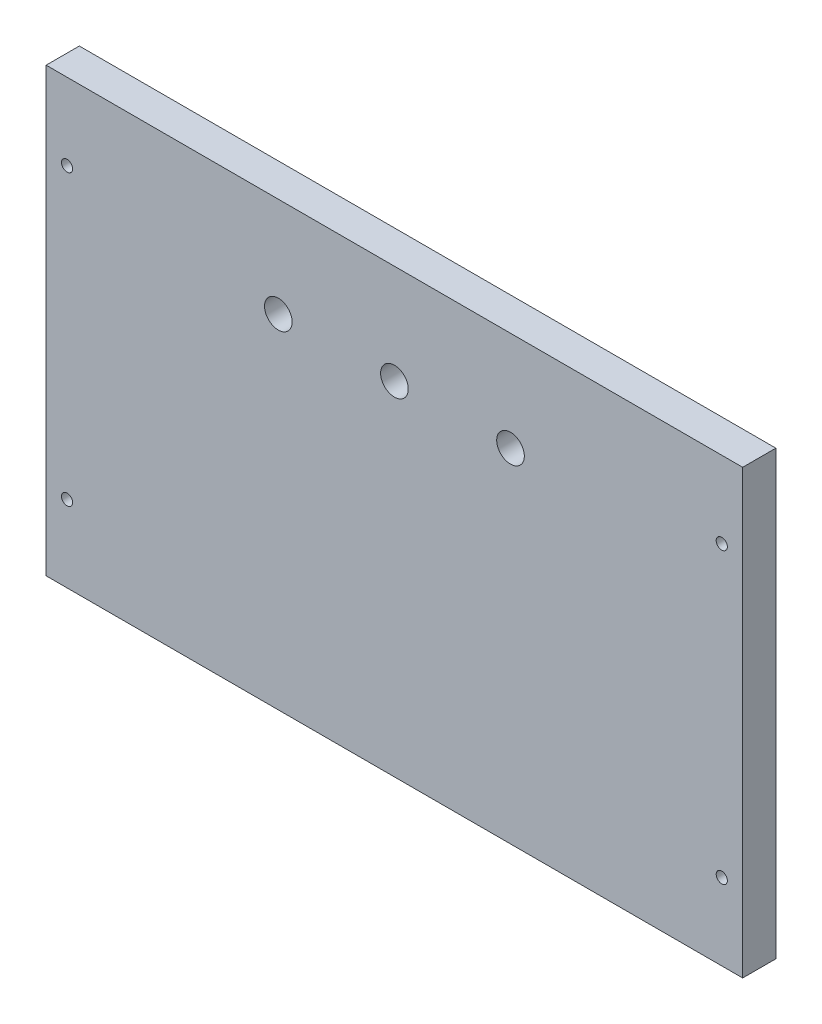
ISO-10303-21;
HEADER;
FILE_DESCRIPTION(('STEP AP214'),'2;1');
FILE_NAME('part.step','',(''),(''),'','','');
FILE_SCHEMA(('AUTOMOTIVE_DESIGN { 1 0 10303 214 1 1 1 1 }'));
ENDSEC;
DATA;
#1=APPLICATION_CONTEXT('core data for automotive mechanical design processes');
#2=APPLICATION_PROTOCOL_DEFINITION('international standard','automotive_design',2000,#1);
#3=PRODUCT_CONTEXT('',#1,'mechanical');
#4=PRODUCT('Part','Part','',(#3));
#5=PRODUCT_RELATED_PRODUCT_CATEGORY('part','',(#4));
#6=PRODUCT_DEFINITION_FORMATION('','',#4);
#7=PRODUCT_DEFINITION_CONTEXT('part definition',#1,'design');
#8=PRODUCT_DEFINITION('design','',#6,#7);
#9=PRODUCT_DEFINITION_SHAPE('','',#8);
#10=(LENGTH_UNIT() NAMED_UNIT(*) SI_UNIT(.MILLI.,.METRE.));
#11=(NAMED_UNIT(*) PLANE_ANGLE_UNIT() SI_UNIT($,.RADIAN.));
#12=(NAMED_UNIT(*) SI_UNIT($,.STERADIAN.) SOLID_ANGLE_UNIT());
#13=UNCERTAINTY_MEASURE_WITH_UNIT(LENGTH_MEASURE(1.E-05),#10,'distance_accuracy_value','');
#14=(GEOMETRIC_REPRESENTATION_CONTEXT(3) GLOBAL_UNCERTAINTY_ASSIGNED_CONTEXT((#13)) GLOBAL_UNIT_ASSIGNED_CONTEXT((#10,
#11,#12)) REPRESENTATION_CONTEXT('',''));
#15=CARTESIAN_POINT('',(0.,0.,0.));
#16=DIRECTION('',(0.,0.,1.));
#17=DIRECTION('',(1.,0.,0.));
#18=AXIS2_PLACEMENT_3D('',#15,#16,#17);
#19=CARTESIAN_POINT('',(0.,0.,9.525));
#20=DIRECTION('',(0.,0.,-1.));
#21=DIRECTION('',(-1.,0.,0.));
#22=AXIS2_PLACEMENT_3D('',#19,#20,#21);
#23=PLANE('',#22);
#24=DIRECTION('',(0.,-1.,0.));
#25=VECTOR('',#24,1.);
#26=CARTESIAN_POINT('',(0.,0.,9.525));
#27=LINE('',#26,#25);
#28=CARTESIAN_POINT('',(0.,127.,9.525));
#29=VERTEX_POINT('',#28);
#30=CARTESIAN_POINT('',(0.,0.,9.525));
#31=VERTEX_POINT('',#30);
#32=EDGE_CURVE('E85',#29,#31,#27,.T.);
#33=ORIENTED_EDGE('',*,*,#32,.T.);
#34=DIRECTION('',(1.,0.,0.));
#35=VECTOR('',#34,1.);
#36=CARTESIAN_POINT('',(0.,0.,9.525));
#37=LINE('',#36,#35);
#38=CARTESIAN_POINT('',(200.,0.,9.525));
#39=VERTEX_POINT('',#38);
#40=EDGE_CURVE('E80',#31,#39,#37,.T.);
#41=ORIENTED_EDGE('',*,*,#40,.T.);
#42=DIRECTION('',(0.,1.,0.));
#43=VECTOR('',#42,1.);
#44=CARTESIAN_POINT('',(200.,0.,9.525));
#45=LINE('',#44,#43);
#46=CARTESIAN_POINT('',(200.,127.,9.525));
#47=VERTEX_POINT('',#46);
#48=EDGE_CURVE('E83',#39,#47,#45,.T.);
#49=ORIENTED_EDGE('',*,*,#48,.T.);
#50=DIRECTION('',(-1.,0.,0.));
#51=VECTOR('',#50,1.);
#52=CARTESIAN_POINT('',(0.,127.,9.525));
#53=LINE('',#52,#51);
#54=EDGE_CURVE('E50',#47,#29,#53,.T.);
#55=ORIENTED_EDGE('',*,*,#54,.T.);
#56=EDGE_LOOP('',(#33,#41,#49,#55));
#57=FACE_BOUND('',#56,.T.);
#58=CARTESIAN_POINT('',(66.6666666666667,98.425,9.525));
#59=DIRECTION('',(0.,0.,1.));
#60=DIRECTION('',(1.,0.,0.));
#61=AXIS2_PLACEMENT_3D('',#58,#59,#60);
#62=CIRCLE('',#61,3.96874999999999);
#63=CARTESIAN_POINT('',(62.6979166666667,98.425,9.525));
#64=VERTEX_POINT('',#63);
#65=EDGE_CURVE('E100',#64,#64,#62,.T.);
#66=ORIENTED_EDGE('',*,*,#65,.F.);
#67=EDGE_LOOP('',(#66));
#68=FACE_BOUND('',#67,.T.);
#69=CARTESIAN_POINT('',(100.,98.425,9.525));
#70=DIRECTION('',(0.,0.,1.));
#71=DIRECTION('',(1.,0.,0.));
#72=AXIS2_PLACEMENT_3D('',#69,#70,#71);
#73=CIRCLE('',#72,3.96874999999999);
#74=CARTESIAN_POINT('',(96.03125,98.425,9.525));
#75=VERTEX_POINT('',#74);
#76=EDGE_CURVE('E115',#75,#75,#73,.T.);
#77=ORIENTED_EDGE('',*,*,#76,.F.);
#78=EDGE_LOOP('',(#77));
#79=FACE_BOUND('',#78,.T.);
#80=CARTESIAN_POINT('',(133.333333333333,98.425,9.525));
#81=DIRECTION('',(0.,0.,1.));
#82=DIRECTION('',(1.,0.,0.));
#83=AXIS2_PLACEMENT_3D('',#80,#81,#82);
#84=CIRCLE('',#83,3.96874999999999);
#85=CARTESIAN_POINT('',(129.364583333333,98.425,9.525));
#86=VERTEX_POINT('',#85);
#87=EDGE_CURVE('E121',#86,#86,#84,.T.);
#88=ORIENTED_EDGE('',*,*,#87,.F.);
#89=EDGE_LOOP('',(#88));
#90=FACE_BOUND('',#89,.T.);
#91=CARTESIAN_POINT('',(6.,22.,9.525));
#92=DIRECTION('',(0.,0.,1.));
#93=DIRECTION('',(1.,0.,0.));
#94=AXIS2_PLACEMENT_3D('',#91,#92,#93);
#95=CIRCLE('',#94,1.6);
#96=CARTESIAN_POINT('',(4.4,22.,9.525));
#97=VERTEX_POINT('',#96);
#98=EDGE_CURVE('E127',#97,#97,#95,.T.);
#99=ORIENTED_EDGE('',*,*,#98,.F.);
#100=EDGE_LOOP('',(#99));
#101=FACE_BOUND('',#100,.T.);
#102=CARTESIAN_POINT('',(194.,22.,9.525));
#103=DIRECTION('',(0.,0.,1.));
#104=DIRECTION('',(1.,0.,0.));
#105=AXIS2_PLACEMENT_3D('',#102,#103,#104);
#106=CIRCLE('',#105,1.59999999999999);
#107=CARTESIAN_POINT('',(192.4,22.,9.525));
#108=VERTEX_POINT('',#107);
#109=EDGE_CURVE('E133',#108,#108,#106,.T.);
#110=ORIENTED_EDGE('',*,*,#109,.F.);
#111=EDGE_LOOP('',(#110));
#112=FACE_BOUND('',#111,.T.);
#113=CARTESIAN_POINT('',(194.,105.,9.525));
#114=DIRECTION('',(0.,0.,1.));
#115=DIRECTION('',(1.,0.,0.));
#116=AXIS2_PLACEMENT_3D('',#113,#114,#115);
#117=CIRCLE('',#116,1.59999999999999);
#118=CARTESIAN_POINT('',(192.4,105.,9.525));
#119=VERTEX_POINT('',#118);
#120=EDGE_CURVE('E139',#119,#119,#117,.T.);
#121=ORIENTED_EDGE('',*,*,#120,.F.);
#122=EDGE_LOOP('',(#121));
#123=FACE_BOUND('',#122,.T.);
#124=CARTESIAN_POINT('',(6.,105.,9.525));
#125=DIRECTION('',(0.,0.,1.));
#126=DIRECTION('',(1.,0.,0.));
#127=AXIS2_PLACEMENT_3D('',#124,#125,#126);
#128=CIRCLE('',#127,1.6);
#129=CARTESIAN_POINT('',(4.4,105.,9.525));
#130=VERTEX_POINT('',#129);
#131=EDGE_CURVE('E145',#130,#130,#128,.T.);
#132=ORIENTED_EDGE('',*,*,#131,.F.);
#133=EDGE_LOOP('',(#132));
#134=FACE_BOUND('',#133,.T.);
#135=ADVANCED_FACE('F33',(#57,#68,#79,#90,#101,#112,#123,#134),#23,.F.);
#136=CARTESIAN_POINT('',(0.,0.,0.));
#137=DIRECTION('',(0.,0.,-1.));
#138=DIRECTION('',(-1.,0.,0.));
#139=AXIS2_PLACEMENT_3D('',#136,#137,#138);
#140=PLANE('',#139);
#141=CARTESIAN_POINT('',(194.,105.,0.));
#142=DIRECTION('',(0.,0.,1.));
#143=DIRECTION('',(1.,0.,0.));
#144=AXIS2_PLACEMENT_3D('',#141,#142,#143);
#145=CIRCLE('',#144,1.59999999999999);
#146=CARTESIAN_POINT('',(192.4,105.,0.));
#147=VERTEX_POINT('',#146);
#148=EDGE_CURVE('E142',#147,#147,#145,.T.);
#149=ORIENTED_EDGE('',*,*,#148,.T.);
#150=EDGE_LOOP('',(#149));
#151=FACE_BOUND('',#150,.T.);
#152=CARTESIAN_POINT('',(6.,22.,0.));
#153=DIRECTION('',(0.,0.,1.));
#154=DIRECTION('',(1.,0.,0.));
#155=AXIS2_PLACEMENT_3D('',#152,#153,#154);
#156=CIRCLE('',#155,1.6);
#157=CARTESIAN_POINT('',(4.4,22.,0.));
#158=VERTEX_POINT('',#157);
#159=EDGE_CURVE('E130',#158,#158,#156,.T.);
#160=ORIENTED_EDGE('',*,*,#159,.T.);
#161=EDGE_LOOP('',(#160));
#162=FACE_BOUND('',#161,.T.);
#163=CARTESIAN_POINT('',(100.,98.425,0.));
#164=DIRECTION('',(0.,0.,1.));
#165=DIRECTION('',(1.,0.,0.));
#166=AXIS2_PLACEMENT_3D('',#163,#164,#165);
#167=CIRCLE('',#166,3.96874999999999);
#168=CARTESIAN_POINT('',(96.03125,98.425,0.));
#169=VERTEX_POINT('',#168);
#170=EDGE_CURVE('E118',#169,#169,#167,.T.);
#171=ORIENTED_EDGE('',*,*,#170,.T.);
#172=EDGE_LOOP('',(#171));
#173=FACE_BOUND('',#172,.T.);
#174=DIRECTION('',(0.,-1.,0.));
#175=VECTOR('',#174,1.);
#176=CARTESIAN_POINT('',(0.,0.,0.));
#177=LINE('',#176,#175);
#178=CARTESIAN_POINT('',(0.,127.,0.));
#179=VERTEX_POINT('',#178);
#180=CARTESIAN_POINT('',(0.,0.,0.));
#181=VERTEX_POINT('',#180);
#182=EDGE_CURVE('E97',#179,#181,#177,.T.);
#183=ORIENTED_EDGE('',*,*,#182,.F.);
#184=DIRECTION('',(-1.,0.,0.));
#185=VECTOR('',#184,1.);
#186=CARTESIAN_POINT('',(0.,127.,0.));
#187=LINE('',#186,#185);
#188=CARTESIAN_POINT('',(200.,127.,0.));
#189=VERTEX_POINT('',#188);
#190=EDGE_CURVE('E73',#189,#179,#187,.T.);
#191=ORIENTED_EDGE('',*,*,#190,.F.);
#192=DIRECTION('',(0.,1.,0.));
#193=VECTOR('',#192,1.);
#194=CARTESIAN_POINT('',(200.,0.,0.));
#195=LINE('',#194,#193);
#196=CARTESIAN_POINT('',(200.,0.,0.));
#197=VERTEX_POINT('',#196);
#198=EDGE_CURVE('E67',#197,#189,#195,.T.);
#199=ORIENTED_EDGE('',*,*,#198,.F.);
#200=DIRECTION('',(1.,0.,0.));
#201=VECTOR('',#200,1.);
#202=CARTESIAN_POINT('',(0.,0.,0.));
#203=LINE('',#202,#201);
#204=EDGE_CURVE('E89',#181,#197,#203,.T.);
#205=ORIENTED_EDGE('',*,*,#204,.F.);
#206=EDGE_LOOP('',(#183,#191,#199,#205));
#207=FACE_BOUND('',#206,.T.);
#208=CARTESIAN_POINT('',(66.6666666666667,98.425,0.));
#209=DIRECTION('',(0.,0.,1.));
#210=DIRECTION('',(1.,0.,0.));
#211=AXIS2_PLACEMENT_3D('',#208,#209,#210);
#212=CIRCLE('',#211,3.96874999999999);
#213=CARTESIAN_POINT('',(62.6979166666667,98.425,0.));
#214=VERTEX_POINT('',#213);
#215=EDGE_CURVE('E112',#214,#214,#212,.T.);
#216=ORIENTED_EDGE('',*,*,#215,.T.);
#217=EDGE_LOOP('',(#216));
#218=FACE_BOUND('',#217,.T.);
#219=CARTESIAN_POINT('',(133.333333333333,98.425,0.));
#220=DIRECTION('',(0.,0.,1.));
#221=DIRECTION('',(1.,0.,0.));
#222=AXIS2_PLACEMENT_3D('',#219,#220,#221);
#223=CIRCLE('',#222,3.96874999999999);
#224=CARTESIAN_POINT('',(129.364583333333,98.425,0.));
#225=VERTEX_POINT('',#224);
#226=EDGE_CURVE('E124',#225,#225,#223,.T.);
#227=ORIENTED_EDGE('',*,*,#226,.T.);
#228=EDGE_LOOP('',(#227));
#229=FACE_BOUND('',#228,.T.);
#230=CARTESIAN_POINT('',(194.,22.,0.));
#231=DIRECTION('',(0.,0.,1.));
#232=DIRECTION('',(1.,0.,0.));
#233=AXIS2_PLACEMENT_3D('',#230,#231,#232);
#234=CIRCLE('',#233,1.59999999999999);
#235=CARTESIAN_POINT('',(192.4,22.,0.));
#236=VERTEX_POINT('',#235);
#237=EDGE_CURVE('E136',#236,#236,#234,.T.);
#238=ORIENTED_EDGE('',*,*,#237,.T.);
#239=EDGE_LOOP('',(#238));
#240=FACE_BOUND('',#239,.T.);
#241=CARTESIAN_POINT('',(6.,105.,0.));
#242=DIRECTION('',(0.,0.,1.));
#243=DIRECTION('',(1.,0.,0.));
#244=AXIS2_PLACEMENT_3D('',#241,#242,#243);
#245=CIRCLE('',#244,1.6);
#246=CARTESIAN_POINT('',(4.4,105.,0.));
#247=VERTEX_POINT('',#246);
#248=EDGE_CURVE('E148',#247,#247,#245,.T.);
#249=ORIENTED_EDGE('',*,*,#248,.T.);
#250=EDGE_LOOP('',(#249));
#251=FACE_BOUND('',#250,.T.);
#252=ADVANCED_FACE('F108',(#151,#162,#173,#207,#218,#229,#240,#251),#140,.T.);
#253=CARTESIAN_POINT('',(0.,0.,9.525));
#254=DIRECTION('',(1.,0.,0.));
#255=DIRECTION('',(0.,0.,-1.));
#256=AXIS2_PLACEMENT_3D('',#253,#254,#255);
#257=PLANE('',#256);
#258=ORIENTED_EDGE('',*,*,#182,.T.);
#259=DIRECTION('',(0.,0.,-1.));
#260=VECTOR('',#259,1.);
#261=CARTESIAN_POINT('',(0.,0.,9.525));
#262=LINE('',#261,#260);
#263=EDGE_CURVE('E11',#31,#181,#262,.T.);
#264=ORIENTED_EDGE('',*,*,#263,.F.);
#265=ORIENTED_EDGE('',*,*,#32,.F.);
#266=DIRECTION('',(0.,0.,-1.));
#267=VECTOR('',#266,1.);
#268=CARTESIAN_POINT('',(0.,127.,9.525));
#269=LINE('',#268,#267);
#270=EDGE_CURVE('E93',#29,#179,#269,.T.);
#271=ORIENTED_EDGE('',*,*,#270,.T.);
#272=EDGE_LOOP('',(#258,#264,#265,#271));
#273=FACE_BOUND('',#272,.T.);
#274=ADVANCED_FACE('F35',(#273),#257,.F.);
#275=CARTESIAN_POINT('',(0.,0.,9.525));
#276=DIRECTION('',(0.,1.,0.));
#277=DIRECTION('',(0.,0.,1.));
#278=AXIS2_PLACEMENT_3D('',#275,#276,#277);
#279=PLANE('',#278);
#280=ORIENTED_EDGE('',*,*,#204,.T.);
#281=DIRECTION('',(0.,0.,-1.));
#282=VECTOR('',#281,1.);
#283=CARTESIAN_POINT('',(200.,0.,9.525));
#284=LINE('',#283,#282);
#285=EDGE_CURVE('E42',#39,#197,#284,.T.);
#286=ORIENTED_EDGE('',*,*,#285,.F.);
#287=ORIENTED_EDGE('',*,*,#40,.F.);
#288=ORIENTED_EDGE('',*,*,#263,.T.);
#289=EDGE_LOOP('',(#280,#286,#287,#288));
#290=FACE_BOUND('',#289,.T.);
#291=ADVANCED_FACE('F88',(#290),#279,.F.);
#292=CARTESIAN_POINT('',(200.,0.,9.525));
#293=DIRECTION('',(-1.,0.,0.));
#294=DIRECTION('',(0.,0.,1.));
#295=AXIS2_PLACEMENT_3D('',#292,#293,#294);
#296=PLANE('',#295);
#297=ORIENTED_EDGE('',*,*,#198,.T.);
#298=DIRECTION('',(0.,0.,-1.));
#299=VECTOR('',#298,1.);
#300=CARTESIAN_POINT('',(200.,127.,9.525));
#301=LINE('',#300,#299);
#302=EDGE_CURVE('E90',#47,#189,#301,.T.);
#303=ORIENTED_EDGE('',*,*,#302,.F.);
#304=ORIENTED_EDGE('',*,*,#48,.F.);
#305=ORIENTED_EDGE('',*,*,#285,.T.);
#306=EDGE_LOOP('',(#297,#303,#304,#305));
#307=FACE_BOUND('',#306,.T.);
#308=ADVANCED_FACE('F91',(#307),#296,.F.);
#309=CARTESIAN_POINT('',(0.,127.,9.525));
#310=DIRECTION('',(0.,-1.,0.));
#311=DIRECTION('',(0.,0.,-1.));
#312=AXIS2_PLACEMENT_3D('',#309,#310,#311);
#313=PLANE('',#312);
#314=ORIENTED_EDGE('',*,*,#190,.T.);
#315=ORIENTED_EDGE('',*,*,#270,.F.);
#316=ORIENTED_EDGE('',*,*,#54,.F.);
#317=ORIENTED_EDGE('',*,*,#302,.T.);
#318=EDGE_LOOP('',(#314,#315,#316,#317));
#319=FACE_BOUND('',#318,.T.);
#320=ADVANCED_FACE('F105',(#319),#313,.F.);
#321=CARTESIAN_POINT('',(66.6666666666667,98.425,9.525));
#322=DIRECTION('',(0.,0.,-1.));
#323=DIRECTION('',(-1.,0.,0.));
#324=AXIS2_PLACEMENT_3D('',#321,#322,#323);
#325=CYLINDRICAL_SURFACE('',#324,3.96874999999999);
#326=CARTESIAN_POINT('',(62.6979166666667,98.425,9.525));
#327=CARTESIAN_POINT('',(62.6979166666667,98.425,9.42578125));
#328=CARTESIAN_POINT('',(62.6979166666667,98.425,9.3265625));
#329=CARTESIAN_POINT('',(62.6979166666667,98.425,9.128125));
#330=CARTESIAN_POINT('',(62.6979166666667,98.425,9.02890625));
#331=CARTESIAN_POINT('',(62.6979166666667,98.425,8.83046875));
#332=CARTESIAN_POINT('',(62.6979166666667,98.425,8.73125));
#333=CARTESIAN_POINT('',(62.6979166666667,98.425,8.5328125));
#334=CARTESIAN_POINT('',(62.6979166666667,98.425,8.43359375));
#335=CARTESIAN_POINT('',(62.6979166666667,98.425,8.23515625));
#336=CARTESIAN_POINT('',(62.6979166666667,98.425,8.1359375));
#337=CARTESIAN_POINT('',(62.6979166666667,98.425,7.9375));
#338=CARTESIAN_POINT('',(62.6979166666667,98.425,7.83828125));
#339=CARTESIAN_POINT('',(62.6979166666667,98.425,7.63984375));
#340=CARTESIAN_POINT('',(62.6979166666667,98.425,7.540625));
#341=CARTESIAN_POINT('',(62.6979166666667,98.425,7.3421875));
#342=CARTESIAN_POINT('',(62.6979166666667,98.425,7.24296875));
#343=CARTESIAN_POINT('',(62.6979166666667,98.425,7.04453125));
#344=CARTESIAN_POINT('',(62.6979166666667,98.425,6.9453125));
#345=CARTESIAN_POINT('',(62.6979166666667,98.425,6.746875));
#346=CARTESIAN_POINT('',(62.6979166666667,98.425,6.64765625));
#347=CARTESIAN_POINT('',(62.6979166666667,98.425,6.44921875));
#348=CARTESIAN_POINT('',(62.6979166666667,98.425,6.35));
#349=CARTESIAN_POINT('',(62.6979166666667,98.425,6.1515625));
#350=CARTESIAN_POINT('',(62.6979166666667,98.425,6.05234375));
#351=CARTESIAN_POINT('',(62.6979166666667,98.425,5.85390625));
#352=CARTESIAN_POINT('',(62.6979166666667,98.425,5.7546875));
#353=CARTESIAN_POINT('',(62.6979166666667,98.425,5.55625));
#354=CARTESIAN_POINT('',(62.6979166666667,98.425,5.45703125));
#355=CARTESIAN_POINT('',(62.6979166666667,98.425,5.25859375));
#356=CARTESIAN_POINT('',(62.6979166666667,98.425,5.159375));
#357=CARTESIAN_POINT('',(62.6979166666667,98.425,4.9609375));
#358=CARTESIAN_POINT('',(62.6979166666667,98.425,4.86171875));
#359=CARTESIAN_POINT('',(62.6979166666667,98.425,4.66328125));
#360=CARTESIAN_POINT('',(62.6979166666667,98.425,4.5640625));
#361=CARTESIAN_POINT('',(62.6979166666667,98.425,4.365625));
#362=CARTESIAN_POINT('',(62.6979166666667,98.425,4.26640625));
#363=CARTESIAN_POINT('',(62.6979166666667,98.425,4.06796875));
#364=CARTESIAN_POINT('',(62.6979166666667,98.425,3.96875));
#365=CARTESIAN_POINT('',(62.6979166666667,98.425,3.7703125));
#366=CARTESIAN_POINT('',(62.6979166666667,98.425,3.67109375));
#367=CARTESIAN_POINT('',(62.6979166666667,98.425,3.47265625));
#368=CARTESIAN_POINT('',(62.6979166666667,98.425,3.3734375));
#369=CARTESIAN_POINT('',(62.6979166666667,98.425,3.175));
#370=CARTESIAN_POINT('',(62.6979166666667,98.425,3.07578125));
#371=CARTESIAN_POINT('',(62.6979166666667,98.425,2.87734375));
#372=CARTESIAN_POINT('',(62.6979166666667,98.425,2.778125));
#373=CARTESIAN_POINT('',(62.6979166666667,98.425,2.5796875));
#374=CARTESIAN_POINT('',(62.6979166666667,98.425,2.48046875));
#375=CARTESIAN_POINT('',(62.6979166666667,98.425,2.28203125));
#376=CARTESIAN_POINT('',(62.6979166666667,98.425,2.1828125));
#377=CARTESIAN_POINT('',(62.6979166666667,98.425,1.984375));
#378=CARTESIAN_POINT('',(62.6979166666667,98.425,1.88515625));
#379=CARTESIAN_POINT('',(62.6979166666667,98.425,1.68671875));
#380=CARTESIAN_POINT('',(62.6979166666667,98.425,1.5875));
#381=CARTESIAN_POINT('',(62.6979166666667,98.425,1.3890625));
#382=CARTESIAN_POINT('',(62.6979166666667,98.425,1.28984375));
#383=CARTESIAN_POINT('',(62.6979166666667,98.425,1.09140625));
#384=CARTESIAN_POINT('',(62.6979166666667,98.425,0.992187500000001));
#385=CARTESIAN_POINT('',(62.6979166666667,98.425,0.793750000000001));
#386=CARTESIAN_POINT('',(62.6979166666667,98.425,0.69453125));
#387=CARTESIAN_POINT('',(62.6979166666667,98.425,0.49609375));
#388=CARTESIAN_POINT('',(62.6979166666667,98.425,0.396875));
#389=CARTESIAN_POINT('',(62.6979166666667,98.425,0.1984375));
#390=CARTESIAN_POINT('',(62.6979166666667,98.425,0.0992187500000001));
#391=CARTESIAN_POINT('',(62.6979166666667,98.425,0.));
#392=B_SPLINE_CURVE_WITH_KNOTS('',3,(#326,#327,#328,#329,#330,#331,#332,#333,#334,#335,#336,
#337,#338,#339,#340,#341,#342,#343,#344,#345,#346,#347,#348,#349,#350,#351,#352,#353,#354,#355,
#356,#357,#358,#359,#360,#361,#362,#363,#364,#365,#366,#367,#368,#369,#370,#371,#372,#373,#374,
#375,#376,#377,#378,#379,#380,#381,#382,#383,#384,#385,#386,#387,#388,#389,#390,#391),
.UNSPECIFIED.,.F.,.F.,(4,2,2,2,2,2,2,2,2,2,2,2,2,2,2,2,2,2,2,2,2,2,2,2,2,2,2,2,2,2,2,2,4),(0.,
0.297656249999998,0.595312499999999,0.892968749999999,1.190625,1.48828125,1.7859375,2.08359375,
2.38125,2.67890625,2.9765625,3.27421875,3.571875,3.86953125,4.1671875,4.46484375,4.7625,
5.06015625,5.3578125,5.65546875,5.953125,6.25078125,6.5484375,6.84609375,7.14375,7.44140625,
7.7390625,8.03671875,8.334375,8.63203125,8.9296875,9.22734375,9.525),.UNSPECIFIED.);
#393=EDGE_CURVE('BSEAM165',#64,#214,#392,.T.);
#394=ORIENTED_EDGE('',*,*,#65,.T.);
#395=ORIENTED_EDGE('',*,*,#215,.F.);
#396=ORIENTED_EDGE('',*,*,#393,.T.);
#397=ORIENTED_EDGE('',*,*,#393,.F.);
#398=EDGE_LOOP('',(#394,#396,#395,#397));
#399=FACE_BOUND('',#398,.T.);
#400=ADVANCED_FACE('F165',(#399),#325,.F.);
#401=CARTESIAN_POINT('',(100.,98.425,9.525));
#402=DIRECTION('',(0.,0.,-1.));
#403=DIRECTION('',(-1.,0.,0.));
#404=AXIS2_PLACEMENT_3D('',#401,#402,#403);
#405=CYLINDRICAL_SURFACE('',#404,3.96874999999999);
#406=CARTESIAN_POINT('',(96.03125,98.425,9.525));
#407=CARTESIAN_POINT('',(96.03125,98.425,9.42578125));
#408=CARTESIAN_POINT('',(96.03125,98.425,9.3265625));
#409=CARTESIAN_POINT('',(96.03125,98.425,9.128125));
#410=CARTESIAN_POINT('',(96.03125,98.425,9.02890625));
#411=CARTESIAN_POINT('',(96.03125,98.425,8.83046875));
#412=CARTESIAN_POINT('',(96.03125,98.425,8.73125));
#413=CARTESIAN_POINT('',(96.03125,98.425,8.5328125));
#414=CARTESIAN_POINT('',(96.03125,98.425,8.43359375));
#415=CARTESIAN_POINT('',(96.03125,98.425,8.23515625));
#416=CARTESIAN_POINT('',(96.03125,98.425,8.1359375));
#417=CARTESIAN_POINT('',(96.03125,98.425,7.9375));
#418=CARTESIAN_POINT('',(96.03125,98.425,7.83828125));
#419=CARTESIAN_POINT('',(96.03125,98.425,7.63984375));
#420=CARTESIAN_POINT('',(96.03125,98.425,7.540625));
#421=CARTESIAN_POINT('',(96.03125,98.425,7.3421875));
#422=CARTESIAN_POINT('',(96.03125,98.425,7.24296875));
#423=CARTESIAN_POINT('',(96.03125,98.425,7.04453125));
#424=CARTESIAN_POINT('',(96.03125,98.425,6.9453125));
#425=CARTESIAN_POINT('',(96.03125,98.425,6.746875));
#426=CARTESIAN_POINT('',(96.03125,98.425,6.64765625));
#427=CARTESIAN_POINT('',(96.03125,98.425,6.44921875));
#428=CARTESIAN_POINT('',(96.03125,98.425,6.35));
#429=CARTESIAN_POINT('',(96.03125,98.425,6.1515625));
#430=CARTESIAN_POINT('',(96.03125,98.425,6.05234375));
#431=CARTESIAN_POINT('',(96.03125,98.425,5.85390625));
#432=CARTESIAN_POINT('',(96.03125,98.425,5.7546875));
#433=CARTESIAN_POINT('',(96.03125,98.425,5.55625));
#434=CARTESIAN_POINT('',(96.03125,98.425,5.45703125));
#435=CARTESIAN_POINT('',(96.03125,98.425,5.25859375));
#436=CARTESIAN_POINT('',(96.03125,98.425,5.159375));
#437=CARTESIAN_POINT('',(96.03125,98.425,4.9609375));
#438=CARTESIAN_POINT('',(96.03125,98.425,4.86171875));
#439=CARTESIAN_POINT('',(96.03125,98.425,4.66328125));
#440=CARTESIAN_POINT('',(96.03125,98.425,4.5640625));
#441=CARTESIAN_POINT('',(96.03125,98.425,4.365625));
#442=CARTESIAN_POINT('',(96.03125,98.425,4.26640625));
#443=CARTESIAN_POINT('',(96.03125,98.425,4.06796875));
#444=CARTESIAN_POINT('',(96.03125,98.425,3.96875));
#445=CARTESIAN_POINT('',(96.03125,98.425,3.7703125));
#446=CARTESIAN_POINT('',(96.03125,98.425,3.67109375));
#447=CARTESIAN_POINT('',(96.03125,98.425,3.47265625));
#448=CARTESIAN_POINT('',(96.03125,98.425,3.3734375));
#449=CARTESIAN_POINT('',(96.03125,98.425,3.175));
#450=CARTESIAN_POINT('',(96.03125,98.425,3.07578125));
#451=CARTESIAN_POINT('',(96.03125,98.425,2.87734375));
#452=CARTESIAN_POINT('',(96.03125,98.425,2.778125));
#453=CARTESIAN_POINT('',(96.03125,98.425,2.5796875));
#454=CARTESIAN_POINT('',(96.03125,98.425,2.48046875));
#455=CARTESIAN_POINT('',(96.03125,98.425,2.28203125));
#456=CARTESIAN_POINT('',(96.03125,98.425,2.1828125));
#457=CARTESIAN_POINT('',(96.03125,98.425,1.984375));
#458=CARTESIAN_POINT('',(96.03125,98.425,1.88515625));
#459=CARTESIAN_POINT('',(96.03125,98.425,1.68671875));
#460=CARTESIAN_POINT('',(96.03125,98.425,1.5875));
#461=CARTESIAN_POINT('',(96.03125,98.425,1.3890625));
#462=CARTESIAN_POINT('',(96.03125,98.425,1.28984375));
#463=CARTESIAN_POINT('',(96.03125,98.425,1.09140625));
#464=CARTESIAN_POINT('',(96.03125,98.425,0.992187500000001));
#465=CARTESIAN_POINT('',(96.03125,98.425,0.793750000000001));
#466=CARTESIAN_POINT('',(96.03125,98.425,0.69453125));
#467=CARTESIAN_POINT('',(96.03125,98.425,0.49609375));
#468=CARTESIAN_POINT('',(96.03125,98.425,0.396875));
#469=CARTESIAN_POINT('',(96.03125,98.425,0.1984375));
#470=CARTESIAN_POINT('',(96.03125,98.425,0.0992187500000001));
#471=CARTESIAN_POINT('',(96.03125,98.425,0.));
#472=B_SPLINE_CURVE_WITH_KNOTS('',3,(#406,#407,#408,#409,#410,#411,#412,#413,#414,#415,#416,
#417,#418,#419,#420,#421,#422,#423,#424,#425,#426,#427,#428,#429,#430,#431,#432,#433,#434,#435,
#436,#437,#438,#439,#440,#441,#442,#443,#444,#445,#446,#447,#448,#449,#450,#451,#452,#453,#454,
#455,#456,#457,#458,#459,#460,#461,#462,#463,#464,#465,#466,#467,#468,#469,#470,#471),
.UNSPECIFIED.,.F.,.F.,(4,2,2,2,2,2,2,2,2,2,2,2,2,2,2,2,2,2,2,2,2,2,2,2,2,2,2,2,2,2,2,2,4),(0.,
0.297656249999998,0.595312499999999,0.892968749999999,1.190625,1.48828125,1.7859375,2.08359375,
2.38125,2.67890625,2.9765625,3.27421875,3.571875,3.86953125,4.1671875,4.46484375,4.7625,
5.06015625,5.3578125,5.65546875,5.953125,6.25078125,6.5484375,6.84609375,7.14375,7.44140625,
7.7390625,8.03671875,8.334375,8.63203125,8.9296875,9.22734375,9.525),.UNSPECIFIED.);
#473=EDGE_CURVE('BSEAM211',#75,#169,#472,.T.);
#474=ORIENTED_EDGE('',*,*,#76,.T.);
#475=ORIENTED_EDGE('',*,*,#170,.F.);
#476=ORIENTED_EDGE('',*,*,#473,.T.);
#477=ORIENTED_EDGE('',*,*,#473,.F.);
#478=EDGE_LOOP('',(#474,#476,#475,#477));
#479=FACE_BOUND('',#478,.T.);
#480=ADVANCED_FACE('F211',(#479),#405,.F.);
#481=CARTESIAN_POINT('',(133.333333333333,98.425,9.525));
#482=DIRECTION('',(0.,0.,-1.));
#483=DIRECTION('',(-1.,0.,0.));
#484=AXIS2_PLACEMENT_3D('',#481,#482,#483);
#485=CYLINDRICAL_SURFACE('',#484,3.96874999999999);
#486=CARTESIAN_POINT('',(129.364583333333,98.425,9.525));
#487=CARTESIAN_POINT('',(129.364583333333,98.425,9.42578125));
#488=CARTESIAN_POINT('',(129.364583333333,98.425,9.3265625));
#489=CARTESIAN_POINT('',(129.364583333333,98.425,9.128125));
#490=CARTESIAN_POINT('',(129.364583333333,98.425,9.02890625));
#491=CARTESIAN_POINT('',(129.364583333333,98.425,8.83046875));
#492=CARTESIAN_POINT('',(129.364583333333,98.425,8.73125));
#493=CARTESIAN_POINT('',(129.364583333333,98.425,8.5328125));
#494=CARTESIAN_POINT('',(129.364583333333,98.425,8.43359375));
#495=CARTESIAN_POINT('',(129.364583333333,98.425,8.23515625));
#496=CARTESIAN_POINT('',(129.364583333333,98.425,8.1359375));
#497=CARTESIAN_POINT('',(129.364583333333,98.425,7.9375));
#498=CARTESIAN_POINT('',(129.364583333333,98.425,7.83828125));
#499=CARTESIAN_POINT('',(129.364583333333,98.425,7.63984375));
#500=CARTESIAN_POINT('',(129.364583333333,98.425,7.540625));
#501=CARTESIAN_POINT('',(129.364583333333,98.425,7.3421875));
#502=CARTESIAN_POINT('',(129.364583333333,98.425,7.24296875));
#503=CARTESIAN_POINT('',(129.364583333333,98.425,7.04453125));
#504=CARTESIAN_POINT('',(129.364583333333,98.425,6.9453125));
#505=CARTESIAN_POINT('',(129.364583333333,98.425,6.746875));
#506=CARTESIAN_POINT('',(129.364583333333,98.425,6.64765625));
#507=CARTESIAN_POINT('',(129.364583333333,98.425,6.44921875));
#508=CARTESIAN_POINT('',(129.364583333333,98.425,6.35));
#509=CARTESIAN_POINT('',(129.364583333333,98.425,6.1515625));
#510=CARTESIAN_POINT('',(129.364583333333,98.425,6.05234375));
#511=CARTESIAN_POINT('',(129.364583333333,98.425,5.85390625));
#512=CARTESIAN_POINT('',(129.364583333333,98.425,5.7546875));
#513=CARTESIAN_POINT('',(129.364583333333,98.425,5.55625));
#514=CARTESIAN_POINT('',(129.364583333333,98.425,5.45703125));
#515=CARTESIAN_POINT('',(129.364583333333,98.425,5.25859375));
#516=CARTESIAN_POINT('',(129.364583333333,98.425,5.159375));
#517=CARTESIAN_POINT('',(129.364583333333,98.425,4.9609375));
#518=CARTESIAN_POINT('',(129.364583333333,98.425,4.86171875));
#519=CARTESIAN_POINT('',(129.364583333333,98.425,4.66328125));
#520=CARTESIAN_POINT('',(129.364583333333,98.425,4.5640625));
#521=CARTESIAN_POINT('',(129.364583333333,98.425,4.365625));
#522=CARTESIAN_POINT('',(129.364583333333,98.425,4.26640625));
#523=CARTESIAN_POINT('',(129.364583333333,98.425,4.06796875));
#524=CARTESIAN_POINT('',(129.364583333333,98.425,3.96875));
#525=CARTESIAN_POINT('',(129.364583333333,98.425,3.7703125));
#526=CARTESIAN_POINT('',(129.364583333333,98.425,3.67109375));
#527=CARTESIAN_POINT('',(129.364583333333,98.425,3.47265625));
#528=CARTESIAN_POINT('',(129.364583333333,98.425,3.3734375));
#529=CARTESIAN_POINT('',(129.364583333333,98.425,3.175));
#530=CARTESIAN_POINT('',(129.364583333333,98.425,3.07578125));
#531=CARTESIAN_POINT('',(129.364583333333,98.425,2.87734375));
#532=CARTESIAN_POINT('',(129.364583333333,98.425,2.778125));
#533=CARTESIAN_POINT('',(129.364583333333,98.425,2.5796875));
#534=CARTESIAN_POINT('',(129.364583333333,98.425,2.48046875));
#535=CARTESIAN_POINT('',(129.364583333333,98.425,2.28203125));
#536=CARTESIAN_POINT('',(129.364583333333,98.425,2.1828125));
#537=CARTESIAN_POINT('',(129.364583333333,98.425,1.984375));
#538=CARTESIAN_POINT('',(129.364583333333,98.425,1.88515625));
#539=CARTESIAN_POINT('',(129.364583333333,98.425,1.68671875));
#540=CARTESIAN_POINT('',(129.364583333333,98.425,1.5875));
#541=CARTESIAN_POINT('',(129.364583333333,98.425,1.3890625));
#542=CARTESIAN_POINT('',(129.364583333333,98.425,1.28984375));
#543=CARTESIAN_POINT('',(129.364583333333,98.425,1.09140625));
#544=CARTESIAN_POINT('',(129.364583333333,98.425,0.992187500000001));
#545=CARTESIAN_POINT('',(129.364583333333,98.425,0.793750000000001));
#546=CARTESIAN_POINT('',(129.364583333333,98.425,0.69453125));
#547=CARTESIAN_POINT('',(129.364583333333,98.425,0.49609375));
#548=CARTESIAN_POINT('',(129.364583333333,98.425,0.396875));
#549=CARTESIAN_POINT('',(129.364583333333,98.425,0.1984375));
#550=CARTESIAN_POINT('',(129.364583333333,98.425,0.0992187500000001));
#551=CARTESIAN_POINT('',(129.364583333333,98.425,0.));
#552=B_SPLINE_CURVE_WITH_KNOTS('',3,(#486,#487,#488,#489,#490,#491,#492,#493,#494,#495,#496,
#497,#498,#499,#500,#501,#502,#503,#504,#505,#506,#507,#508,#509,#510,#511,#512,#513,#514,#515,
#516,#517,#518,#519,#520,#521,#522,#523,#524,#525,#526,#527,#528,#529,#530,#531,#532,#533,#534,
#535,#536,#537,#538,#539,#540,#541,#542,#543,#544,#545,#546,#547,#548,#549,#550,#551),
.UNSPECIFIED.,.F.,.F.,(4,2,2,2,2,2,2,2,2,2,2,2,2,2,2,2,2,2,2,2,2,2,2,2,2,2,2,2,2,2,2,2,4),(0.,
0.297656249999998,0.595312499999999,0.892968749999999,1.190625,1.48828125,1.7859375,2.08359375,
2.38125,2.67890625,2.9765625,3.27421875,3.571875,3.86953125,4.1671875,4.46484375,4.7625,
5.06015625,5.3578125,5.65546875,5.953125,6.25078125,6.5484375,6.84609375,7.14375,7.44140625,
7.7390625,8.03671875,8.334375,8.63203125,8.9296875,9.22734375,9.525),.UNSPECIFIED.);
#553=EDGE_CURVE('BSEAM219',#86,#225,#552,.T.);
#554=ORIENTED_EDGE('',*,*,#87,.T.);
#555=ORIENTED_EDGE('',*,*,#226,.F.);
#556=ORIENTED_EDGE('',*,*,#553,.T.);
#557=ORIENTED_EDGE('',*,*,#553,.F.);
#558=EDGE_LOOP('',(#554,#556,#555,#557));
#559=FACE_BOUND('',#558,.T.);
#560=ADVANCED_FACE('F219',(#559),#485,.F.);
#561=CARTESIAN_POINT('',(6.,22.,9.525));
#562=DIRECTION('',(0.,0.,-1.));
#563=DIRECTION('',(-1.,0.,0.));
#564=AXIS2_PLACEMENT_3D('',#561,#562,#563);
#565=CYLINDRICAL_SURFACE('',#564,1.6);
#566=CARTESIAN_POINT('',(4.4,22.,9.525));
#567=CARTESIAN_POINT('',(4.4,22.,9.42578125));
#568=CARTESIAN_POINT('',(4.4,22.,9.3265625));
#569=CARTESIAN_POINT('',(4.4,22.,9.128125));
#570=CARTESIAN_POINT('',(4.4,22.,9.02890625));
#571=CARTESIAN_POINT('',(4.4,22.,8.83046875));
#572=CARTESIAN_POINT('',(4.4,22.,8.73125));
#573=CARTESIAN_POINT('',(4.4,22.,8.5328125));
#574=CARTESIAN_POINT('',(4.4,22.,8.43359375));
#575=CARTESIAN_POINT('',(4.4,22.,8.23515625));
#576=CARTESIAN_POINT('',(4.4,22.,8.1359375));
#577=CARTESIAN_POINT('',(4.4,22.,7.9375));
#578=CARTESIAN_POINT('',(4.4,22.,7.83828125));
#579=CARTESIAN_POINT('',(4.4,22.,7.63984375));
#580=CARTESIAN_POINT('',(4.4,22.,7.540625));
#581=CARTESIAN_POINT('',(4.4,22.,7.3421875));
#582=CARTESIAN_POINT('',(4.4,22.,7.24296875));
#583=CARTESIAN_POINT('',(4.4,22.,7.04453125));
#584=CARTESIAN_POINT('',(4.4,22.,6.9453125));
#585=CARTESIAN_POINT('',(4.4,22.,6.746875));
#586=CARTESIAN_POINT('',(4.4,22.,6.64765625));
#587=CARTESIAN_POINT('',(4.4,22.,6.44921875));
#588=CARTESIAN_POINT('',(4.4,22.,6.35));
#589=CARTESIAN_POINT('',(4.4,22.,6.1515625));
#590=CARTESIAN_POINT('',(4.4,22.,6.05234375));
#591=CARTESIAN_POINT('',(4.4,22.,5.85390625));
#592=CARTESIAN_POINT('',(4.4,22.,5.7546875));
#593=CARTESIAN_POINT('',(4.4,22.,5.55625));
#594=CARTESIAN_POINT('',(4.4,22.,5.45703125));
#595=CARTESIAN_POINT('',(4.4,22.,5.25859375));
#596=CARTESIAN_POINT('',(4.4,22.,5.159375));
#597=CARTESIAN_POINT('',(4.4,22.,4.9609375));
#598=CARTESIAN_POINT('',(4.4,22.,4.86171875));
#599=CARTESIAN_POINT('',(4.4,22.,4.66328125));
#600=CARTESIAN_POINT('',(4.4,22.,4.5640625));
#601=CARTESIAN_POINT('',(4.4,22.,4.365625));
#602=CARTESIAN_POINT('',(4.4,22.,4.26640625));
#603=CARTESIAN_POINT('',(4.4,22.,4.06796875));
#604=CARTESIAN_POINT('',(4.4,22.,3.96875));
#605=CARTESIAN_POINT('',(4.4,22.,3.7703125));
#606=CARTESIAN_POINT('',(4.4,22.,3.67109375));
#607=CARTESIAN_POINT('',(4.4,22.,3.47265625));
#608=CARTESIAN_POINT('',(4.4,22.,3.3734375));
#609=CARTESIAN_POINT('',(4.4,22.,3.175));
#610=CARTESIAN_POINT('',(4.4,22.,3.07578125));
#611=CARTESIAN_POINT('',(4.4,22.,2.87734375));
#612=CARTESIAN_POINT('',(4.4,22.,2.778125));
#613=CARTESIAN_POINT('',(4.4,22.,2.5796875));
#614=CARTESIAN_POINT('',(4.4,22.,2.48046875));
#615=CARTESIAN_POINT('',(4.4,22.,2.28203125));
#616=CARTESIAN_POINT('',(4.4,22.,2.1828125));
#617=CARTESIAN_POINT('',(4.4,22.,1.984375));
#618=CARTESIAN_POINT('',(4.4,22.,1.88515625));
#619=CARTESIAN_POINT('',(4.4,22.,1.68671875));
#620=CARTESIAN_POINT('',(4.4,22.,1.5875));
#621=CARTESIAN_POINT('',(4.4,22.,1.3890625));
#622=CARTESIAN_POINT('',(4.4,22.,1.28984375));
#623=CARTESIAN_POINT('',(4.4,22.,1.09140625));
#624=CARTESIAN_POINT('',(4.4,22.,0.992187500000001));
#625=CARTESIAN_POINT('',(4.4,22.,0.793750000000001));
#626=CARTESIAN_POINT('',(4.4,22.,0.69453125));
#627=CARTESIAN_POINT('',(4.4,22.,0.49609375));
#628=CARTESIAN_POINT('',(4.4,22.,0.396875));
#629=CARTESIAN_POINT('',(4.4,22.,0.1984375));
#630=CARTESIAN_POINT('',(4.4,22.,0.0992187500000001));
#631=CARTESIAN_POINT('',(4.4,22.,0.));
#632=B_SPLINE_CURVE_WITH_KNOTS('',3,(#566,#567,#568,#569,#570,#571,#572,#573,#574,#575,#576,
#577,#578,#579,#580,#581,#582,#583,#584,#585,#586,#587,#588,#589,#590,#591,#592,#593,#594,#595,
#596,#597,#598,#599,#600,#601,#602,#603,#604,#605,#606,#607,#608,#609,#610,#611,#612,#613,#614,
#615,#616,#617,#618,#619,#620,#621,#622,#623,#624,#625,#626,#627,#628,#629,#630,#631),
.UNSPECIFIED.,.F.,.F.,(4,2,2,2,2,2,2,2,2,2,2,2,2,2,2,2,2,2,2,2,2,2,2,2,2,2,2,2,2,2,2,2,4),(0.,
0.29765625,0.5953125,0.892968750000001,1.190625,1.48828125,1.7859375,2.08359375,2.38125,
2.67890625,2.9765625,3.27421875,3.571875,3.86953125,4.1671875,4.46484375,4.7625,5.06015625,
5.3578125,5.65546875,5.953125,6.25078125,6.5484375,6.84609375,7.14375,7.44140625,7.7390625,
8.03671875,8.334375,8.63203125,8.9296875,9.22734375,9.525),.UNSPECIFIED.);
#633=EDGE_CURVE('BSEAM227',#97,#158,#632,.T.);
#634=ORIENTED_EDGE('',*,*,#98,.T.);
#635=ORIENTED_EDGE('',*,*,#159,.F.);
#636=ORIENTED_EDGE('',*,*,#633,.T.);
#637=ORIENTED_EDGE('',*,*,#633,.F.);
#638=EDGE_LOOP('',(#634,#636,#635,#637));
#639=FACE_BOUND('',#638,.T.);
#640=ADVANCED_FACE('F227',(#639),#565,.F.);
#641=CARTESIAN_POINT('',(194.,22.,9.525));
#642=DIRECTION('',(0.,0.,-1.));
#643=DIRECTION('',(-1.,0.,0.));
#644=AXIS2_PLACEMENT_3D('',#641,#642,#643);
#645=CYLINDRICAL_SURFACE('',#644,1.59999999999999);
#646=CARTESIAN_POINT('',(192.4,22.,9.525));
#647=CARTESIAN_POINT('',(192.4,22.,9.42578125));
#648=CARTESIAN_POINT('',(192.4,22.,9.3265625));
#649=CARTESIAN_POINT('',(192.4,22.,9.128125));
#650=CARTESIAN_POINT('',(192.4,22.,9.02890625));
#651=CARTESIAN_POINT('',(192.4,22.,8.83046875));
#652=CARTESIAN_POINT('',(192.4,22.,8.73125));
#653=CARTESIAN_POINT('',(192.4,22.,8.5328125));
#654=CARTESIAN_POINT('',(192.4,22.,8.43359375));
#655=CARTESIAN_POINT('',(192.4,22.,8.23515625));
#656=CARTESIAN_POINT('',(192.4,22.,8.1359375));
#657=CARTESIAN_POINT('',(192.4,22.,7.9375));
#658=CARTESIAN_POINT('',(192.4,22.,7.83828125));
#659=CARTESIAN_POINT('',(192.4,22.,7.63984375));
#660=CARTESIAN_POINT('',(192.4,22.,7.540625));
#661=CARTESIAN_POINT('',(192.4,22.,7.3421875));
#662=CARTESIAN_POINT('',(192.4,22.,7.24296875));
#663=CARTESIAN_POINT('',(192.4,22.,7.04453125));
#664=CARTESIAN_POINT('',(192.4,22.,6.9453125));
#665=CARTESIAN_POINT('',(192.4,22.,6.746875));
#666=CARTESIAN_POINT('',(192.4,22.,6.64765625));
#667=CARTESIAN_POINT('',(192.4,22.,6.44921875));
#668=CARTESIAN_POINT('',(192.4,22.,6.35));
#669=CARTESIAN_POINT('',(192.4,22.,6.1515625));
#670=CARTESIAN_POINT('',(192.4,22.,6.05234375));
#671=CARTESIAN_POINT('',(192.4,22.,5.85390625));
#672=CARTESIAN_POINT('',(192.4,22.,5.7546875));
#673=CARTESIAN_POINT('',(192.4,22.,5.55625));
#674=CARTESIAN_POINT('',(192.4,22.,5.45703125));
#675=CARTESIAN_POINT('',(192.4,22.,5.25859375));
#676=CARTESIAN_POINT('',(192.4,22.,5.159375));
#677=CARTESIAN_POINT('',(192.4,22.,4.9609375));
#678=CARTESIAN_POINT('',(192.4,22.,4.86171875));
#679=CARTESIAN_POINT('',(192.4,22.,4.66328125));
#680=CARTESIAN_POINT('',(192.4,22.,4.5640625));
#681=CARTESIAN_POINT('',(192.4,22.,4.365625));
#682=CARTESIAN_POINT('',(192.4,22.,4.26640625));
#683=CARTESIAN_POINT('',(192.4,22.,4.06796875));
#684=CARTESIAN_POINT('',(192.4,22.,3.96875));
#685=CARTESIAN_POINT('',(192.4,22.,3.7703125));
#686=CARTESIAN_POINT('',(192.4,22.,3.67109375));
#687=CARTESIAN_POINT('',(192.4,22.,3.47265625));
#688=CARTESIAN_POINT('',(192.4,22.,3.3734375));
#689=CARTESIAN_POINT('',(192.4,22.,3.175));
#690=CARTESIAN_POINT('',(192.4,22.,3.07578125));
#691=CARTESIAN_POINT('',(192.4,22.,2.87734375));
#692=CARTESIAN_POINT('',(192.4,22.,2.778125));
#693=CARTESIAN_POINT('',(192.4,22.,2.5796875));
#694=CARTESIAN_POINT('',(192.4,22.,2.48046875));
#695=CARTESIAN_POINT('',(192.4,22.,2.28203125));
#696=CARTESIAN_POINT('',(192.4,22.,2.1828125));
#697=CARTESIAN_POINT('',(192.4,22.,1.984375));
#698=CARTESIAN_POINT('',(192.4,22.,1.88515625));
#699=CARTESIAN_POINT('',(192.4,22.,1.68671875));
#700=CARTESIAN_POINT('',(192.4,22.,1.5875));
#701=CARTESIAN_POINT('',(192.4,22.,1.3890625));
#702=CARTESIAN_POINT('',(192.4,22.,1.28984375));
#703=CARTESIAN_POINT('',(192.4,22.,1.09140625));
#704=CARTESIAN_POINT('',(192.4,22.,0.992187500000001));
#705=CARTESIAN_POINT('',(192.4,22.,0.793750000000001));
#706=CARTESIAN_POINT('',(192.4,22.,0.69453125));
#707=CARTESIAN_POINT('',(192.4,22.,0.49609375));
#708=CARTESIAN_POINT('',(192.4,22.,0.396875));
#709=CARTESIAN_POINT('',(192.4,22.,0.1984375));
#710=CARTESIAN_POINT('',(192.4,22.,0.0992187500000001));
#711=CARTESIAN_POINT('',(192.4,22.,0.));
#712=B_SPLINE_CURVE_WITH_KNOTS('',3,(#646,#647,#648,#649,#650,#651,#652,#653,#654,#655,#656,
#657,#658,#659,#660,#661,#662,#663,#664,#665,#666,#667,#668,#669,#670,#671,#672,#673,#674,#675,
#676,#677,#678,#679,#680,#681,#682,#683,#684,#685,#686,#687,#688,#689,#690,#691,#692,#693,#694,
#695,#696,#697,#698,#699,#700,#701,#702,#703,#704,#705,#706,#707,#708,#709,#710,#711),
.UNSPECIFIED.,.F.,.F.,(4,2,2,2,2,2,2,2,2,2,2,2,2,2,2,2,2,2,2,2,2,2,2,2,2,2,2,2,2,2,2,2,4),(0.,
0.29765625,0.5953125,0.892968750000001,1.190625,1.48828125,1.7859375,2.08359375,2.38125,
2.67890625,2.9765625,3.27421875,3.571875,3.86953125,4.1671875,4.46484375,4.7625,5.06015625,
5.3578125,5.65546875,5.953125,6.25078125,6.5484375,6.84609375,7.14375,7.44140625,7.7390625,
8.03671875,8.334375,8.63203125,8.9296875,9.22734375,9.525),.UNSPECIFIED.);
#713=EDGE_CURVE('BSEAM236',#108,#236,#712,.T.);
#714=ORIENTED_EDGE('',*,*,#109,.T.);
#715=ORIENTED_EDGE('',*,*,#237,.F.);
#716=ORIENTED_EDGE('',*,*,#713,.T.);
#717=ORIENTED_EDGE('',*,*,#713,.F.);
#718=EDGE_LOOP('',(#714,#716,#715,#717));
#719=FACE_BOUND('',#718,.T.);
#720=ADVANCED_FACE('F236',(#719),#645,.F.);
#721=CARTESIAN_POINT('',(194.,105.,9.525));
#722=DIRECTION('',(0.,0.,-1.));
#723=DIRECTION('',(-1.,0.,0.));
#724=AXIS2_PLACEMENT_3D('',#721,#722,#723);
#725=CYLINDRICAL_SURFACE('',#724,1.59999999999999);
#726=CARTESIAN_POINT('',(192.4,105.,9.525));
#727=CARTESIAN_POINT('',(192.4,105.,9.42578125));
#728=CARTESIAN_POINT('',(192.4,105.,9.3265625));
#729=CARTESIAN_POINT('',(192.4,105.,9.128125));
#730=CARTESIAN_POINT('',(192.4,105.,9.02890625));
#731=CARTESIAN_POINT('',(192.4,105.,8.83046875));
#732=CARTESIAN_POINT('',(192.4,105.,8.73125));
#733=CARTESIAN_POINT('',(192.4,105.,8.5328125));
#734=CARTESIAN_POINT('',(192.4,105.,8.43359375));
#735=CARTESIAN_POINT('',(192.4,105.,8.23515625));
#736=CARTESIAN_POINT('',(192.4,105.,8.1359375));
#737=CARTESIAN_POINT('',(192.4,105.,7.9375));
#738=CARTESIAN_POINT('',(192.4,105.,7.83828125));
#739=CARTESIAN_POINT('',(192.4,105.,7.63984375));
#740=CARTESIAN_POINT('',(192.4,105.,7.540625));
#741=CARTESIAN_POINT('',(192.4,105.,7.3421875));
#742=CARTESIAN_POINT('',(192.4,105.,7.24296875));
#743=CARTESIAN_POINT('',(192.4,105.,7.04453125));
#744=CARTESIAN_POINT('',(192.4,105.,6.9453125));
#745=CARTESIAN_POINT('',(192.4,105.,6.746875));
#746=CARTESIAN_POINT('',(192.4,105.,6.64765625));
#747=CARTESIAN_POINT('',(192.4,105.,6.44921875));
#748=CARTESIAN_POINT('',(192.4,105.,6.35));
#749=CARTESIAN_POINT('',(192.4,105.,6.1515625));
#750=CARTESIAN_POINT('',(192.4,105.,6.05234375));
#751=CARTESIAN_POINT('',(192.4,105.,5.85390625));
#752=CARTESIAN_POINT('',(192.4,105.,5.7546875));
#753=CARTESIAN_POINT('',(192.4,105.,5.55625));
#754=CARTESIAN_POINT('',(192.4,105.,5.45703125));
#755=CARTESIAN_POINT('',(192.4,105.,5.25859375));
#756=CARTESIAN_POINT('',(192.4,105.,5.159375));
#757=CARTESIAN_POINT('',(192.4,105.,4.9609375));
#758=CARTESIAN_POINT('',(192.4,105.,4.86171875));
#759=CARTESIAN_POINT('',(192.4,105.,4.66328125));
#760=CARTESIAN_POINT('',(192.4,105.,4.5640625));
#761=CARTESIAN_POINT('',(192.4,105.,4.365625));
#762=CARTESIAN_POINT('',(192.4,105.,4.26640625));
#763=CARTESIAN_POINT('',(192.4,105.,4.06796875));
#764=CARTESIAN_POINT('',(192.4,105.,3.96875));
#765=CARTESIAN_POINT('',(192.4,105.,3.7703125));
#766=CARTESIAN_POINT('',(192.4,105.,3.67109375));
#767=CARTESIAN_POINT('',(192.4,105.,3.47265625));
#768=CARTESIAN_POINT('',(192.4,105.,3.3734375));
#769=CARTESIAN_POINT('',(192.4,105.,3.175));
#770=CARTESIAN_POINT('',(192.4,105.,3.07578125));
#771=CARTESIAN_POINT('',(192.4,105.,2.87734375));
#772=CARTESIAN_POINT('',(192.4,105.,2.778125));
#773=CARTESIAN_POINT('',(192.4,105.,2.5796875));
#774=CARTESIAN_POINT('',(192.4,105.,2.48046875));
#775=CARTESIAN_POINT('',(192.4,105.,2.28203125));
#776=CARTESIAN_POINT('',(192.4,105.,2.1828125));
#777=CARTESIAN_POINT('',(192.4,105.,1.984375));
#778=CARTESIAN_POINT('',(192.4,105.,1.88515625));
#779=CARTESIAN_POINT('',(192.4,105.,1.68671875));
#780=CARTESIAN_POINT('',(192.4,105.,1.5875));
#781=CARTESIAN_POINT('',(192.4,105.,1.3890625));
#782=CARTESIAN_POINT('',(192.4,105.,1.28984375));
#783=CARTESIAN_POINT('',(192.4,105.,1.09140625));
#784=CARTESIAN_POINT('',(192.4,105.,0.992187500000001));
#785=CARTESIAN_POINT('',(192.4,105.,0.793750000000001));
#786=CARTESIAN_POINT('',(192.4,105.,0.69453125));
#787=CARTESIAN_POINT('',(192.4,105.,0.49609375));
#788=CARTESIAN_POINT('',(192.4,105.,0.396875));
#789=CARTESIAN_POINT('',(192.4,105.,0.1984375));
#790=CARTESIAN_POINT('',(192.4,105.,0.0992187500000001));
#791=CARTESIAN_POINT('',(192.4,105.,0.));
#792=B_SPLINE_CURVE_WITH_KNOTS('',3,(#726,#727,#728,#729,#730,#731,#732,#733,#734,#735,#736,
#737,#738,#739,#740,#741,#742,#743,#744,#745,#746,#747,#748,#749,#750,#751,#752,#753,#754,#755,
#756,#757,#758,#759,#760,#761,#762,#763,#764,#765,#766,#767,#768,#769,#770,#771,#772,#773,#774,
#775,#776,#777,#778,#779,#780,#781,#782,#783,#784,#785,#786,#787,#788,#789,#790,#791),
.UNSPECIFIED.,.F.,.F.,(4,2,2,2,2,2,2,2,2,2,2,2,2,2,2,2,2,2,2,2,2,2,2,2,2,2,2,2,2,2,2,2,4),(0.,
0.29765625,0.5953125,0.892968750000001,1.190625,1.48828125,1.7859375,2.08359375,2.38125,
2.67890625,2.9765625,3.27421875,3.571875,3.86953125,4.1671875,4.46484375,4.7625,5.06015625,
5.3578125,5.65546875,5.953125,6.25078125,6.5484375,6.84609375,7.14375,7.44140625,7.7390625,
8.03671875,8.334375,8.63203125,8.9296875,9.22734375,9.525),.UNSPECIFIED.);
#793=EDGE_CURVE('BSEAM245',#119,#147,#792,.T.);
#794=ORIENTED_EDGE('',*,*,#120,.T.);
#795=ORIENTED_EDGE('',*,*,#148,.F.);
#796=ORIENTED_EDGE('',*,*,#793,.T.);
#797=ORIENTED_EDGE('',*,*,#793,.F.);
#798=EDGE_LOOP('',(#794,#796,#795,#797));
#799=FACE_BOUND('',#798,.T.);
#800=ADVANCED_FACE('F245',(#799),#725,.F.);
#801=CARTESIAN_POINT('',(6.,105.,9.525));
#802=DIRECTION('',(0.,0.,-1.));
#803=DIRECTION('',(-1.,0.,0.));
#804=AXIS2_PLACEMENT_3D('',#801,#802,#803);
#805=CYLINDRICAL_SURFACE('',#804,1.6);
#806=CARTESIAN_POINT('',(4.4,105.,9.525));
#807=CARTESIAN_POINT('',(4.4,105.,9.42578125));
#808=CARTESIAN_POINT('',(4.4,105.,9.3265625));
#809=CARTESIAN_POINT('',(4.4,105.,9.128125));
#810=CARTESIAN_POINT('',(4.4,105.,9.02890625));
#811=CARTESIAN_POINT('',(4.4,105.,8.83046875));
#812=CARTESIAN_POINT('',(4.4,105.,8.73125));
#813=CARTESIAN_POINT('',(4.4,105.,8.5328125));
#814=CARTESIAN_POINT('',(4.4,105.,8.43359375));
#815=CARTESIAN_POINT('',(4.4,105.,8.23515625));
#816=CARTESIAN_POINT('',(4.4,105.,8.1359375));
#817=CARTESIAN_POINT('',(4.4,105.,7.9375));
#818=CARTESIAN_POINT('',(4.4,105.,7.83828125));
#819=CARTESIAN_POINT('',(4.4,105.,7.63984375));
#820=CARTESIAN_POINT('',(4.4,105.,7.540625));
#821=CARTESIAN_POINT('',(4.4,105.,7.3421875));
#822=CARTESIAN_POINT('',(4.4,105.,7.24296875));
#823=CARTESIAN_POINT('',(4.4,105.,7.04453125));
#824=CARTESIAN_POINT('',(4.4,105.,6.9453125));
#825=CARTESIAN_POINT('',(4.4,105.,6.746875));
#826=CARTESIAN_POINT('',(4.4,105.,6.64765625));
#827=CARTESIAN_POINT('',(4.4,105.,6.44921875));
#828=CARTESIAN_POINT('',(4.4,105.,6.35));
#829=CARTESIAN_POINT('',(4.4,105.,6.1515625));
#830=CARTESIAN_POINT('',(4.4,105.,6.05234375));
#831=CARTESIAN_POINT('',(4.4,105.,5.85390625));
#832=CARTESIAN_POINT('',(4.4,105.,5.7546875));
#833=CARTESIAN_POINT('',(4.4,105.,5.55625));
#834=CARTESIAN_POINT('',(4.4,105.,5.45703125));
#835=CARTESIAN_POINT('',(4.4,105.,5.25859375));
#836=CARTESIAN_POINT('',(4.4,105.,5.159375));
#837=CARTESIAN_POINT('',(4.4,105.,4.9609375));
#838=CARTESIAN_POINT('',(4.4,105.,4.86171875));
#839=CARTESIAN_POINT('',(4.4,105.,4.66328125));
#840=CARTESIAN_POINT('',(4.4,105.,4.5640625));
#841=CARTESIAN_POINT('',(4.4,105.,4.365625));
#842=CARTESIAN_POINT('',(4.4,105.,4.26640625));
#843=CARTESIAN_POINT('',(4.4,105.,4.06796875));
#844=CARTESIAN_POINT('',(4.4,105.,3.96875));
#845=CARTESIAN_POINT('',(4.4,105.,3.7703125));
#846=CARTESIAN_POINT('',(4.4,105.,3.67109375));
#847=CARTESIAN_POINT('',(4.4,105.,3.47265625));
#848=CARTESIAN_POINT('',(4.4,105.,3.3734375));
#849=CARTESIAN_POINT('',(4.4,105.,3.175));
#850=CARTESIAN_POINT('',(4.4,105.,3.07578125));
#851=CARTESIAN_POINT('',(4.4,105.,2.87734375));
#852=CARTESIAN_POINT('',(4.4,105.,2.778125));
#853=CARTESIAN_POINT('',(4.4,105.,2.5796875));
#854=CARTESIAN_POINT('',(4.4,105.,2.48046875));
#855=CARTESIAN_POINT('',(4.4,105.,2.28203125));
#856=CARTESIAN_POINT('',(4.4,105.,2.1828125));
#857=CARTESIAN_POINT('',(4.4,105.,1.984375));
#858=CARTESIAN_POINT('',(4.4,105.,1.88515625));
#859=CARTESIAN_POINT('',(4.4,105.,1.68671875));
#860=CARTESIAN_POINT('',(4.4,105.,1.5875));
#861=CARTESIAN_POINT('',(4.4,105.,1.3890625));
#862=CARTESIAN_POINT('',(4.4,105.,1.28984375));
#863=CARTESIAN_POINT('',(4.4,105.,1.09140625));
#864=CARTESIAN_POINT('',(4.4,105.,0.992187500000001));
#865=CARTESIAN_POINT('',(4.4,105.,0.793750000000001));
#866=CARTESIAN_POINT('',(4.4,105.,0.69453125));
#867=CARTESIAN_POINT('',(4.4,105.,0.49609375));
#868=CARTESIAN_POINT('',(4.4,105.,0.396875));
#869=CARTESIAN_POINT('',(4.4,105.,0.1984375));
#870=CARTESIAN_POINT('',(4.4,105.,0.0992187500000001));
#871=CARTESIAN_POINT('',(4.4,105.,0.));
#872=B_SPLINE_CURVE_WITH_KNOTS('',3,(#806,#807,#808,#809,#810,#811,#812,#813,#814,#815,#816,
#817,#818,#819,#820,#821,#822,#823,#824,#825,#826,#827,#828,#829,#830,#831,#832,#833,#834,#835,
#836,#837,#838,#839,#840,#841,#842,#843,#844,#845,#846,#847,#848,#849,#850,#851,#852,#853,#854,
#855,#856,#857,#858,#859,#860,#861,#862,#863,#864,#865,#866,#867,#868,#869,#870,#871),
.UNSPECIFIED.,.F.,.F.,(4,2,2,2,2,2,2,2,2,2,2,2,2,2,2,2,2,2,2,2,2,2,2,2,2,2,2,2,2,2,2,2,4),(0.,
0.29765625,0.5953125,0.892968750000001,1.190625,1.48828125,1.7859375,2.08359375,2.38125,
2.67890625,2.9765625,3.27421875,3.571875,3.86953125,4.1671875,4.46484375,4.7625,5.06015625,
5.3578125,5.65546875,5.953125,6.25078125,6.5484375,6.84609375,7.14375,7.44140625,7.7390625,
8.03671875,8.334375,8.63203125,8.9296875,9.22734375,9.525),.UNSPECIFIED.);
#873=EDGE_CURVE('BSEAM154',#130,#247,#872,.T.);
#874=ORIENTED_EDGE('',*,*,#131,.T.);
#875=ORIENTED_EDGE('',*,*,#248,.F.);
#876=ORIENTED_EDGE('',*,*,#873,.T.);
#877=ORIENTED_EDGE('',*,*,#873,.F.);
#878=EDGE_LOOP('',(#874,#876,#875,#877));
#879=FACE_BOUND('',#878,.T.);
#880=ADVANCED_FACE('F154',(#879),#805,.F.);
#881=CLOSED_SHELL('',(#135,#252,#274,#291,#308,#320,#400,#480,#560,#640,#720,#800,#880));
#882=MANIFOLD_SOLID_BREP('B2',#881);
#883=ADVANCED_BREP_SHAPE_REPRESENTATION('',(#18,#882),#14);
#884=SHAPE_DEFINITION_REPRESENTATION(#9,#883);
ENDSEC;
END-ISO-10303-21;
